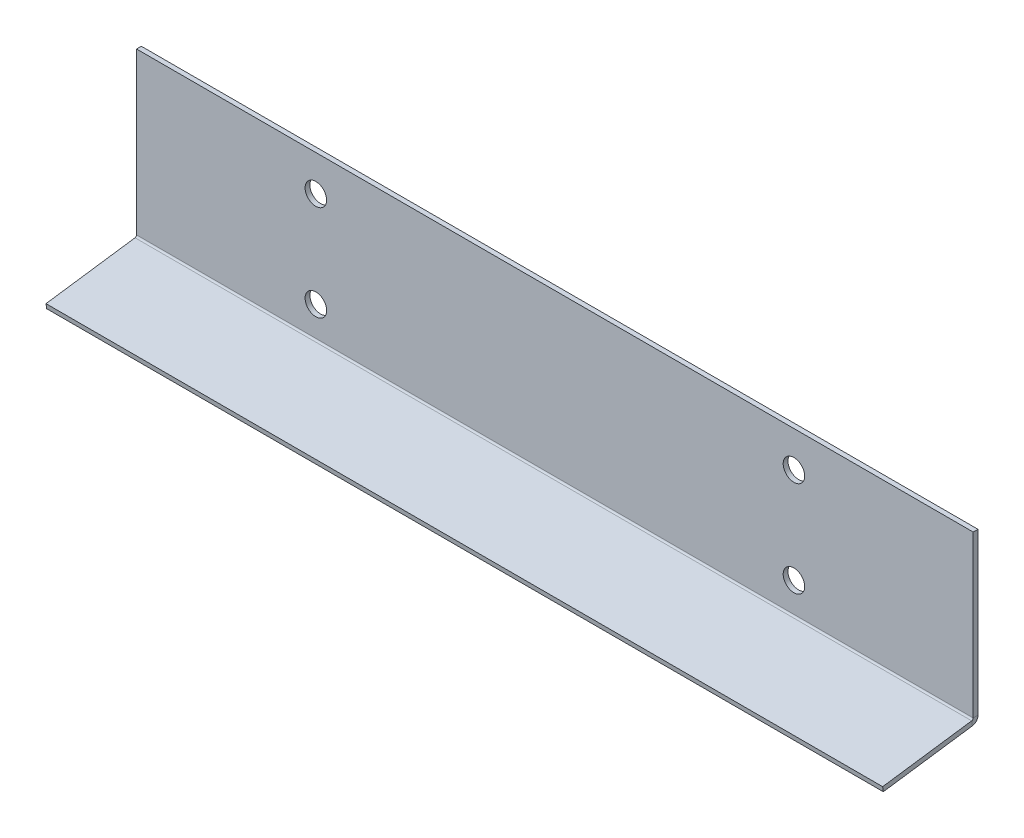
ISO-10303-21;
HEADER;
FILE_DESCRIPTION(('STEP AP214'),'2;1');
FILE_NAME('part.step','',(''),(''),'','','');
FILE_SCHEMA(('AUTOMOTIVE_DESIGN { 1 0 10303 214 1 1 1 1 }'));
ENDSEC;
DATA;
#1=APPLICATION_CONTEXT('core data for automotive mechanical design processes');
#2=APPLICATION_PROTOCOL_DEFINITION('international standard','automotive_design',2000,#1);
#3=PRODUCT_CONTEXT('',#1,'mechanical');
#4=PRODUCT('Part','Part','',(#3));
#5=PRODUCT_RELATED_PRODUCT_CATEGORY('part','',(#4));
#6=PRODUCT_DEFINITION_FORMATION('','',#4);
#7=PRODUCT_DEFINITION_CONTEXT('part definition',#1,'design');
#8=PRODUCT_DEFINITION('design','',#6,#7);
#9=PRODUCT_DEFINITION_SHAPE('','',#8);
#10=(LENGTH_UNIT() NAMED_UNIT(*) SI_UNIT(.MILLI.,.METRE.));
#11=(NAMED_UNIT(*) PLANE_ANGLE_UNIT() SI_UNIT($,.RADIAN.));
#12=(NAMED_UNIT(*) SI_UNIT($,.STERADIAN.) SOLID_ANGLE_UNIT());
#13=UNCERTAINTY_MEASURE_WITH_UNIT(LENGTH_MEASURE(1.E-05),#10,'distance_accuracy_value','');
#14=(GEOMETRIC_REPRESENTATION_CONTEXT(3) GLOBAL_UNCERTAINTY_ASSIGNED_CONTEXT((#13)) GLOBAL_UNIT_ASSIGNED_CONTEXT((#10,
#11,#12)) REPRESENTATION_CONTEXT('',''));
#15=CARTESIAN_POINT('',(0.,0.,0.));
#16=DIRECTION('',(0.,0.,1.));
#17=DIRECTION('',(1.,0.,0.));
#18=AXIS2_PLACEMENT_3D('',#15,#16,#17);
#19=CARTESIAN_POINT('',(175.,-35.,-2.));
#20=DIRECTION('',(1.,0.,0.));
#21=DIRECTION('',(0.,0.,-1.));
#22=AXIS2_PLACEMENT_3D('',#19,#20,#21);
#23=PLANE('',#22);
#24=DIRECTION('',(0.,1.,0.));
#25=VECTOR('',#24,1.);
#26=CARTESIAN_POINT('',(175.,-35.,0.));
#27=LINE('',#26,#25);
#28=CARTESIAN_POINT('',(175.,-32.3400282438873,0.));
#29=VERTEX_POINT('',#28);
#30=CARTESIAN_POINT('',(175.,35.,0.));
#31=VERTEX_POINT('',#30);
#32=EDGE_CURVE('E105',#29,#31,#27,.T.);
#33=ORIENTED_EDGE('',*,*,#32,.F.);
#34=DIRECTION('',(0.,0.,-1.));
#35=VECTOR('',#34,1.);
#36=CARTESIAN_POINT('',(175.,-32.3400282438873,0.));
#37=LINE('',#36,#35);
#38=CARTESIAN_POINT('',(175.,-32.3400282438873,-2.00000000000001));
#39=VERTEX_POINT('',#38);
#40=EDGE_CURVE('E117',#29,#39,#37,.T.);
#41=ORIENTED_EDGE('',*,*,#40,.T.);
#42=DIRECTION('',(0.,1.,0.));
#43=VECTOR('',#42,1.);
#44=CARTESIAN_POINT('',(175.,-35.,-2.));
#45=LINE('',#44,#43);
#46=CARTESIAN_POINT('',(175.,35.,-2.));
#47=VERTEX_POINT('',#46);
#48=EDGE_CURVE('E111',#39,#47,#45,.T.);
#49=ORIENTED_EDGE('',*,*,#48,.T.);
#50=DIRECTION('',(0.,0.,1.));
#51=VECTOR('',#50,1.);
#52=CARTESIAN_POINT('',(175.,35.,-2.));
#53=LINE('',#52,#51);
#54=EDGE_CURVE('E64',#47,#31,#53,.T.);
#55=ORIENTED_EDGE('',*,*,#54,.T.);
#56=EDGE_LOOP('',(#33,#41,#49,#55));
#57=FACE_BOUND('',#56,.T.);
#58=ADVANCED_FACE('F60',(#57),#23,.T.);
#59=CARTESIAN_POINT('',(0.,0.,-2.));
#60=DIRECTION('',(0.,0.,1.));
#61=DIRECTION('',(1.,0.,0.));
#62=AXIS2_PLACEMENT_3D('',#59,#60,#61);
#63=PLANE('',#62);
#64=CARTESIAN_POINT('',(-100.,20.,-2.00000000000002));
#65=DIRECTION('',(0.,0.,1.));
#66=DIRECTION('',(1.,0.,0.));
#67=AXIS2_PLACEMENT_3D('',#64,#65,#66);
#68=CIRCLE('',#67,4.5);
#69=CARTESIAN_POINT('',(-95.5,20.,-2.00000000000002));
#70=VERTEX_POINT('',#69);
#71=EDGE_CURVE('E191',#70,#70,#68,.T.);
#72=ORIENTED_EDGE('',*,*,#71,.T.);
#73=EDGE_LOOP('',(#72));
#74=FACE_BOUND('',#73,.T.);
#75=CARTESIAN_POINT('',(-100.,-20.,-2.00000000000002));
#76=DIRECTION('',(0.,0.,1.));
#77=DIRECTION('',(1.,0.,0.));
#78=AXIS2_PLACEMENT_3D('',#75,#76,#77);
#79=CIRCLE('',#78,4.5);
#80=CARTESIAN_POINT('',(-95.5,-20.,-2.00000000000002));
#81=VERTEX_POINT('',#80);
#82=EDGE_CURVE('E185',#81,#81,#79,.T.);
#83=ORIENTED_EDGE('',*,*,#82,.T.);
#84=EDGE_LOOP('',(#83));
#85=FACE_BOUND('',#84,.T.);
#86=CARTESIAN_POINT('',(100.,-20.,-2.00000000000002));
#87=DIRECTION('',(0.,0.,1.));
#88=DIRECTION('',(1.,0.,0.));
#89=AXIS2_PLACEMENT_3D('',#86,#87,#88);
#90=CIRCLE('',#89,4.5);
#91=CARTESIAN_POINT('',(104.5,-20.,-2.00000000000002));
#92=VERTEX_POINT('',#91);
#93=EDGE_CURVE('E179',#92,#92,#90,.T.);
#94=ORIENTED_EDGE('',*,*,#93,.T.);
#95=EDGE_LOOP('',(#94));
#96=FACE_BOUND('',#95,.T.);
#97=CARTESIAN_POINT('',(100.,20.,-2.00000000000002));
#98=DIRECTION('',(0.,0.,1.));
#99=DIRECTION('',(1.,0.,0.));
#100=AXIS2_PLACEMENT_3D('',#97,#98,#99);
#101=CIRCLE('',#100,4.5);
#102=CARTESIAN_POINT('',(104.5,20.,-2.00000000000002));
#103=VERTEX_POINT('',#102);
#104=EDGE_CURVE('E142',#103,#103,#101,.T.);
#105=ORIENTED_EDGE('',*,*,#104,.T.);
#106=EDGE_LOOP('',(#105));
#107=FACE_BOUND('',#106,.T.);
#108=DIRECTION('',(1.,0.,0.));
#109=VECTOR('',#108,1.);
#110=CARTESIAN_POINT('',(175.,-32.3400282438873,-2.00000000000001));
#111=LINE('',#110,#109);
#112=CARTESIAN_POINT('',(-175.,-32.3400282438873,-2.));
#113=VERTEX_POINT('',#112);
#114=EDGE_CURVE('E133',#39,#113,#111,.F.);
#115=ORIENTED_EDGE('',*,*,#114,.T.);
#116=DIRECTION('',(0.,-1.,0.));
#117=VECTOR('',#116,1.);
#118=CARTESIAN_POINT('',(-175.,-35.,-2.));
#119=LINE('',#118,#117);
#120=CARTESIAN_POINT('',(-175.,35.,-2.));
#121=VERTEX_POINT('',#120);
#122=EDGE_CURVE('E109',#121,#113,#119,.T.);
#123=ORIENTED_EDGE('',*,*,#122,.F.);
#124=DIRECTION('',(-1.,0.,0.));
#125=VECTOR('',#124,1.);
#126=CARTESIAN_POINT('',(175.,35.,-2.));
#127=LINE('',#126,#125);
#128=EDGE_CURVE('E99',#47,#121,#127,.T.);
#129=ORIENTED_EDGE('',*,*,#128,.F.);
#130=ORIENTED_EDGE('',*,*,#48,.F.);
#131=EDGE_LOOP('',(#115,#123,#129,#130));
#132=FACE_BOUND('',#131,.T.);
#133=ADVANCED_FACE('F202',(#74,#85,#96,#107,#132),#63,.F.);
#134=CARTESIAN_POINT('',(0.,0.,0.));
#135=DIRECTION('',(0.,0.,1.));
#136=DIRECTION('',(1.,0.,0.));
#137=AXIS2_PLACEMENT_3D('',#134,#135,#136);
#138=PLANE('',#137);
#139=CARTESIAN_POINT('',(-100.,20.,0.));
#140=DIRECTION('',(0.,0.,1.));
#141=DIRECTION('',(1.,0.,0.));
#142=AXIS2_PLACEMENT_3D('',#139,#140,#141);
#143=CIRCLE('',#142,4.5);
#144=CARTESIAN_POINT('',(-95.5,20.,0.));
#145=VERTEX_POINT('',#144);
#146=EDGE_CURVE('E194',#145,#145,#143,.T.);
#147=ORIENTED_EDGE('',*,*,#146,.F.);
#148=EDGE_LOOP('',(#147));
#149=FACE_BOUND('',#148,.T.);
#150=CARTESIAN_POINT('',(-100.,-20.,0.));
#151=DIRECTION('',(0.,0.,1.));
#152=DIRECTION('',(1.,0.,0.));
#153=AXIS2_PLACEMENT_3D('',#150,#151,#152);
#154=CIRCLE('',#153,4.5);
#155=CARTESIAN_POINT('',(-95.5,-20.,0.));
#156=VERTEX_POINT('',#155);
#157=EDGE_CURVE('E188',#156,#156,#154,.T.);
#158=ORIENTED_EDGE('',*,*,#157,.F.);
#159=EDGE_LOOP('',(#158));
#160=FACE_BOUND('',#159,.T.);
#161=CARTESIAN_POINT('',(100.,-20.,0.));
#162=DIRECTION('',(0.,0.,1.));
#163=DIRECTION('',(1.,0.,0.));
#164=AXIS2_PLACEMENT_3D('',#161,#162,#163);
#165=CIRCLE('',#164,4.5);
#166=CARTESIAN_POINT('',(104.5,-20.,0.));
#167=VERTEX_POINT('',#166);
#168=EDGE_CURVE('E182',#167,#167,#165,.T.);
#169=ORIENTED_EDGE('',*,*,#168,.F.);
#170=EDGE_LOOP('',(#169));
#171=FACE_BOUND('',#170,.T.);
#172=CARTESIAN_POINT('',(100.,20.,0.));
#173=DIRECTION('',(0.,0.,1.));
#174=DIRECTION('',(1.,0.,0.));
#175=AXIS2_PLACEMENT_3D('',#172,#173,#174);
#176=CIRCLE('',#175,4.5);
#177=CARTESIAN_POINT('',(104.5,20.,0.));
#178=VERTEX_POINT('',#177);
#179=EDGE_CURVE('E176',#178,#178,#176,.T.);
#180=ORIENTED_EDGE('',*,*,#179,.F.);
#181=EDGE_LOOP('',(#180));
#182=FACE_BOUND('',#181,.T.);
#183=DIRECTION('',(0.,-1.,0.));
#184=VECTOR('',#183,1.);
#185=CARTESIAN_POINT('',(-175.,-35.,0.));
#186=LINE('',#185,#184);
#187=CARTESIAN_POINT('',(-175.,35.,0.));
#188=VERTEX_POINT('',#187);
#189=CARTESIAN_POINT('',(-175.,-32.3400282438873,0.));
#190=VERTEX_POINT('',#189);
#191=EDGE_CURVE('E101',#188,#190,#186,.T.);
#192=ORIENTED_EDGE('',*,*,#191,.T.);
#193=DIRECTION('',(1.,0.,0.));
#194=VECTOR('',#193,1.);
#195=CARTESIAN_POINT('',(175.,-32.3400282438873,0.));
#196=LINE('',#195,#194);
#197=EDGE_CURVE('E75',#29,#190,#196,.F.);
#198=ORIENTED_EDGE('',*,*,#197,.F.);
#199=ORIENTED_EDGE('',*,*,#32,.T.);
#200=DIRECTION('',(-1.,0.,0.));
#201=VECTOR('',#200,1.);
#202=CARTESIAN_POINT('',(175.,35.,0.));
#203=LINE('',#202,#201);
#204=EDGE_CURVE('E97',#31,#188,#203,.T.);
#205=ORIENTED_EDGE('',*,*,#204,.T.);
#206=EDGE_LOOP('',(#192,#198,#199,#205));
#207=FACE_BOUND('',#206,.T.);
#208=ADVANCED_FACE('F107',(#149,#160,#171,#182,#207),#138,.T.);
#209=CARTESIAN_POINT('',(-175.,-35.,-2.));
#210=DIRECTION('',(-1.,0.,0.));
#211=DIRECTION('',(0.,0.,1.));
#212=AXIS2_PLACEMENT_3D('',#209,#210,#211);
#213=PLANE('',#212);
#214=DIRECTION('',(0.,0.,-1.));
#215=VECTOR('',#214,1.);
#216=CARTESIAN_POINT('',(-175.,-32.3400282438873,0.));
#217=LINE('',#216,#215);
#218=EDGE_CURVE('E104',#190,#113,#217,.T.);
#219=ORIENTED_EDGE('',*,*,#218,.F.);
#220=ORIENTED_EDGE('',*,*,#191,.F.);
#221=DIRECTION('',(0.,0.,1.));
#222=VECTOR('',#221,1.);
#223=CARTESIAN_POINT('',(-175.,35.,-2.));
#224=LINE('',#223,#222);
#225=EDGE_CURVE('E13',#121,#188,#224,.T.);
#226=ORIENTED_EDGE('',*,*,#225,.F.);
#227=ORIENTED_EDGE('',*,*,#122,.T.);
#228=EDGE_LOOP('',(#219,#220,#226,#227));
#229=FACE_BOUND('',#228,.T.);
#230=ADVANCED_FACE('F62',(#229),#213,.T.);
#231=CARTESIAN_POINT('',(175.,35.,-2.));
#232=DIRECTION('',(0.,1.,0.));
#233=DIRECTION('',(-1.,0.,0.));
#234=AXIS2_PLACEMENT_3D('',#231,#232,#233);
#235=PLANE('',#234);
#236=ORIENTED_EDGE('',*,*,#204,.F.);
#237=ORIENTED_EDGE('',*,*,#54,.F.);
#238=ORIENTED_EDGE('',*,*,#128,.T.);
#239=ORIENTED_EDGE('',*,*,#225,.T.);
#240=EDGE_LOOP('',(#236,#237,#238,#239));
#241=FACE_BOUND('',#240,.T.);
#242=ADVANCED_FACE('F94',(#241),#235,.T.);
#243=CARTESIAN_POINT('',(-175.,-32.3400282438874,0.736599999999989));
#244=DIRECTION('',(-1.,0.,0.));
#245=DIRECTION('',(0.,0.,1.));
#246=AXIS2_PLACEMENT_3D('',#243,#244,#245);
#247=PLANE('',#246);
#248=DIRECTION('',(0.,0.99026806874157,0.139173100960069));
#249=VECTOR('',#248,1.);
#250=CARTESIAN_POINT('',(-175.,-35.0499958408056,0.355738891912671));
#251=LINE('',#250,#249);
#252=CARTESIAN_POINT('',(-175.,-33.0694597033224,0.634085093832799));
#253=VERTEX_POINT('',#252);
#254=CARTESIAN_POINT('',(-175.,-35.0499958408056,0.355738891912661));
#255=VERTEX_POINT('',#254);
#256=EDGE_CURVE('E138',#253,#255,#251,.F.);
#257=ORIENTED_EDGE('',*,*,#256,.F.);
#258=CARTESIAN_POINT('',(-175.,-32.3400282438874,0.736599999999989));
#259=DIRECTION('',(1.,0.,0.));
#260=DIRECTION('',(0.,0.,-1.));
#261=AXIS2_PLACEMENT_3D('',#258,#259,#260);
#262=CIRCLE('',#261,0.736600000000021);
#263=EDGE_CURVE('E127',#190,#253,#262,.F.);
#264=ORIENTED_EDGE('',*,*,#263,.F.);
#265=ORIENTED_EDGE('',*,*,#218,.T.);
#266=CARTESIAN_POINT('',(-175.,-32.3400282438874,0.736599999999989));
#267=DIRECTION('',(1.,0.,0.));
#268=DIRECTION('',(0.,0.,-1.));
#269=AXIS2_PLACEMENT_3D('',#266,#267,#268);
#270=CIRCLE('',#269,2.73660000000002);
#271=EDGE_CURVE('E120',#113,#255,#270,.F.);
#272=ORIENTED_EDGE('',*,*,#271,.T.);
#273=EDGE_LOOP('',(#257,#264,#265,#272));
#274=FACE_BOUND('',#273,.T.);
#275=ADVANCED_FACE('F237',(#274),#247,.T.);
#276=CARTESIAN_POINT('',(175.,-32.3400282438874,0.736600000000015));
#277=DIRECTION('',(-1.,0.,0.));
#278=DIRECTION('',(0.,0.,1.));
#279=AXIS2_PLACEMENT_3D('',#276,#277,#278);
#280=PLANE('',#279);
#281=CARTESIAN_POINT('',(175.,-32.3400282438874,0.736600000000015));
#282=DIRECTION('',(1.,0.,0.));
#283=DIRECTION('',(0.,0.,-1.));
#284=AXIS2_PLACEMENT_3D('',#281,#282,#283);
#285=CIRCLE('',#284,0.736600000000021);
#286=CARTESIAN_POINT('',(175.,-33.0694597033224,0.634085093832825));
#287=VERTEX_POINT('',#286);
#288=EDGE_CURVE('E122',#287,#29,#285,.T.);
#289=ORIENTED_EDGE('',*,*,#288,.F.);
#290=DIRECTION('',(0.,0.99026806874157,0.139173100960069));
#291=VECTOR('',#290,1.);
#292=CARTESIAN_POINT('',(175.,-33.0694597033224,0.634085093832823));
#293=LINE('',#292,#291);
#294=CARTESIAN_POINT('',(175.,-35.0499958408055,0.355738891912683));
#295=VERTEX_POINT('',#294);
#296=EDGE_CURVE('E145',#287,#295,#293,.F.);
#297=ORIENTED_EDGE('',*,*,#296,.T.);
#298=CARTESIAN_POINT('',(175.,-32.3400282438874,0.736600000000015));
#299=DIRECTION('',(1.,0.,0.));
#300=DIRECTION('',(0.,0.,-1.));
#301=AXIS2_PLACEMENT_3D('',#298,#299,#300);
#302=CIRCLE('',#301,2.73660000000002);
#303=EDGE_CURVE('E130',#295,#39,#302,.T.);
#304=ORIENTED_EDGE('',*,*,#303,.T.);
#305=ORIENTED_EDGE('',*,*,#40,.F.);
#306=EDGE_LOOP('',(#289,#297,#304,#305));
#307=FACE_BOUND('',#306,.T.);
#308=ADVANCED_FACE('F239',(#307),#280,.F.);
#309=CARTESIAN_POINT('',(175.,-32.3400282438874,0.736600000000015));
#310=DIRECTION('',(1.,0.,0.));
#311=DIRECTION('',(0.,-0.99026806874157,-0.139173100960069));
#312=AXIS2_PLACEMENT_3D('',#309,#310,#311);
#313=CYLINDRICAL_SURFACE('',#312,2.73660000000002);
#314=ORIENTED_EDGE('',*,*,#114,.F.);
#315=ORIENTED_EDGE('',*,*,#303,.F.);
#316=DIRECTION('',(1.,0.,0.));
#317=VECTOR('',#316,1.);
#318=CARTESIAN_POINT('',(-175.,-35.0499958408056,0.355738891912669));
#319=LINE('',#318,#317);
#320=EDGE_CURVE('E148',#295,#255,#319,.F.);
#321=ORIENTED_EDGE('',*,*,#320,.T.);
#322=ORIENTED_EDGE('',*,*,#271,.F.);
#323=EDGE_LOOP('',(#314,#315,#321,#322));
#324=FACE_BOUND('',#323,.T.);
#325=ADVANCED_FACE('F242',(#324),#313,.T.);
#326=CARTESIAN_POINT('',(175.,-32.3400282438874,0.736600000000015));
#327=DIRECTION('',(1.,0.,0.));
#328=DIRECTION('',(0.,-0.99026806874157,-0.139173100960069));
#329=AXIS2_PLACEMENT_3D('',#326,#327,#328);
#330=CYLINDRICAL_SURFACE('',#329,0.736600000000021);
#331=ORIENTED_EDGE('',*,*,#197,.T.);
#332=ORIENTED_EDGE('',*,*,#263,.T.);
#333=DIRECTION('',(1.,0.,0.));
#334=VECTOR('',#333,1.);
#335=CARTESIAN_POINT('',(-175.,-33.0694597033224,0.634085093832809));
#336=LINE('',#335,#334);
#337=EDGE_CURVE('E141',#253,#287,#336,.T.);
#338=ORIENTED_EDGE('',*,*,#337,.T.);
#339=ORIENTED_EDGE('',*,*,#288,.T.);
#340=EDGE_LOOP('',(#331,#332,#338,#339));
#341=FACE_BOUND('',#340,.T.);
#342=ADVANCED_FACE('F247',(#341),#330,.F.);
#343=CARTESIAN_POINT('',(-175.,-34.9608809924459,-0.278346201920139));
#344=DIRECTION('',(1.,0.,0.));
#345=DIRECTION('',(0.,1.,0.));
#346=AXIS2_PLACEMENT_3D('',#343,#344,#345);
#347=PLANE('',#346);
#348=ORIENTED_EDGE('',*,*,#256,.T.);
#349=DIRECTION('',(0.,0.139173100960069,-0.99026806874157));
#350=VECTOR('',#349,1.);
#351=CARTESIAN_POINT('',(-175.,-34.2829606713665,-5.10199992871776));
#352=LINE('',#351,#350);
#353=CARTESIAN_POINT('',(-175.,-40.285842368998,37.6107227496628));
#354=VERTEX_POINT('',#353);
#355=EDGE_CURVE('E160',#354,#255,#352,.T.);
#356=ORIENTED_EDGE('',*,*,#355,.F.);
#357=DIRECTION('',(0.,0.99026806874157,0.139173100960069));
#358=VECTOR('',#357,1.);
#359=CARTESIAN_POINT('',(-175.,-40.285842368998,37.6107227496628));
#360=LINE('',#359,#358);
#361=CARTESIAN_POINT('',(-175.,-38.3053062315149,37.8890689515829));
#362=VERTEX_POINT('',#361);
#363=EDGE_CURVE('E169',#354,#362,#360,.T.);
#364=ORIENTED_EDGE('',*,*,#363,.T.);
#365=DIRECTION('',(0.,-0.139173100960069,0.99026806874157));
#366=VECTOR('',#365,1.);
#367=CARTESIAN_POINT('',(-175.,-32.9803448549628,0.));
#368=LINE('',#367,#366);
#369=EDGE_CURVE('E151',#362,#253,#368,.F.);
#370=ORIENTED_EDGE('',*,*,#369,.T.);
#371=EDGE_LOOP('',(#348,#356,#364,#370));
#372=FACE_BOUND('',#371,.T.);
#373=ADVANCED_FACE('F250',(#372),#347,.F.);
#374=CARTESIAN_POINT('',(175.,-40.285842368998,37.6107227496628));
#375=DIRECTION('',(-1.,0.,0.));
#376=DIRECTION('',(0.,-1.,0.));
#377=AXIS2_PLACEMENT_3D('',#374,#375,#376);
#378=PLANE('',#377);
#379=ORIENTED_EDGE('',*,*,#296,.F.);
#380=DIRECTION('',(0.,0.139173100960069,-0.99026806874157));
#381=VECTOR('',#380,1.);
#382=CARTESIAN_POINT('',(175.,-38.3053062315149,37.8890689515829));
#383=LINE('',#382,#381);
#384=CARTESIAN_POINT('',(175.,-38.3053062315149,37.8890689515829));
#385=VERTEX_POINT('',#384);
#386=EDGE_CURVE('E154',#287,#385,#383,.F.);
#387=ORIENTED_EDGE('',*,*,#386,.T.);
#388=DIRECTION('',(0.,0.99026806874157,0.139173100960069));
#389=VECTOR('',#388,1.);
#390=CARTESIAN_POINT('',(175.,-40.285842368998,37.6107227496628));
#391=LINE('',#390,#389);
#392=CARTESIAN_POINT('',(175.,-40.285842368998,37.6107227496628));
#393=VERTEX_POINT('',#392);
#394=EDGE_CURVE('E125',#393,#385,#391,.T.);
#395=ORIENTED_EDGE('',*,*,#394,.F.);
#396=DIRECTION('',(0.,-0.139173100960069,0.99026806874157));
#397=VECTOR('',#396,1.);
#398=CARTESIAN_POINT('',(175.,-34.2829606713665,-5.10199992871775));
#399=LINE('',#398,#397);
#400=EDGE_CURVE('E163',#295,#393,#399,.T.);
#401=ORIENTED_EDGE('',*,*,#400,.F.);
#402=EDGE_LOOP('',(#379,#387,#395,#401));
#403=FACE_BOUND('',#402,.T.);
#404=ADVANCED_FACE('F257',(#403),#378,.F.);
#405=CARTESIAN_POINT('',(0.,-34.2829606713665,-5.10199992871776));
#406=DIRECTION('',(0.,0.99026806874157,0.139173100960069));
#407=DIRECTION('',(0.,-0.139173100960069,0.99026806874157));
#408=AXIS2_PLACEMENT_3D('',#405,#406,#407);
#409=PLANE('',#408);
#410=ORIENTED_EDGE('',*,*,#320,.F.);
#411=ORIENTED_EDGE('',*,*,#400,.T.);
#412=DIRECTION('',(-1.,0.,0.));
#413=VECTOR('',#412,1.);
#414=CARTESIAN_POINT('',(0.,-40.285842368998,37.6107227496628));
#415=LINE('',#414,#413);
#416=EDGE_CURVE('E166',#393,#354,#415,.T.);
#417=ORIENTED_EDGE('',*,*,#416,.T.);
#418=ORIENTED_EDGE('',*,*,#355,.T.);
#419=EDGE_LOOP('',(#410,#411,#417,#418));
#420=FACE_BOUND('',#419,.T.);
#421=ADVANCED_FACE('F260',(#420),#409,.F.);
#422=CARTESIAN_POINT('',(0.,-32.3024245338833,-4.82365372679762));
#423=DIRECTION('',(0.,0.99026806874157,0.139173100960069));
#424=DIRECTION('',(0.,-0.139173100960069,0.99026806874157));
#425=AXIS2_PLACEMENT_3D('',#422,#423,#424);
#426=PLANE('',#425);
#427=ORIENTED_EDGE('',*,*,#386,.F.);
#428=ORIENTED_EDGE('',*,*,#337,.F.);
#429=ORIENTED_EDGE('',*,*,#369,.F.);
#430=DIRECTION('',(1.,0.,0.));
#431=VECTOR('',#430,1.);
#432=CARTESIAN_POINT('',(-175.,-38.3053062315149,37.8890689515829));
#433=LINE('',#432,#431);
#434=EDGE_CURVE('E157',#385,#362,#433,.F.);
#435=ORIENTED_EDGE('',*,*,#434,.F.);
#436=EDGE_LOOP('',(#427,#428,#429,#435));
#437=FACE_BOUND('',#436,.T.);
#438=ADVANCED_FACE('F223',(#437),#426,.T.);
#439=CARTESIAN_POINT('',(-175.,-40.285842368998,37.6107227496628));
#440=DIRECTION('',(0.,0.139173100960069,-0.99026806874157));
#441=DIRECTION('',(0.,0.99026806874157,0.139173100960069));
#442=AXIS2_PLACEMENT_3D('',#439,#440,#441);
#443=PLANE('',#442);
#444=ORIENTED_EDGE('',*,*,#434,.T.);
#445=ORIENTED_EDGE('',*,*,#363,.F.);
#446=ORIENTED_EDGE('',*,*,#416,.F.);
#447=ORIENTED_EDGE('',*,*,#394,.T.);
#448=EDGE_LOOP('',(#444,#445,#446,#447));
#449=FACE_BOUND('',#448,.T.);
#450=ADVANCED_FACE('F213',(#449),#443,.F.);
#451=CARTESIAN_POINT('',(100.,20.,0.));
#452=DIRECTION('',(0.,0.,1.));
#453=DIRECTION('',(1.,0.,0.));
#454=AXIS2_PLACEMENT_3D('',#451,#452,#453);
#455=CYLINDRICAL_SURFACE('',#454,4.5);
#456=ORIENTED_EDGE('',*,*,#104,.F.);
#457=EDGE_LOOP('',(#456));
#458=FACE_BOUND('',#457,.T.);
#459=ORIENTED_EDGE('',*,*,#179,.T.);
#460=EDGE_LOOP('',(#459));
#461=FACE_BOUND('',#460,.T.);
#462=ADVANCED_FACE('F210',(#458,#461),#455,.F.);
#463=CARTESIAN_POINT('',(100.,-20.,0.));
#464=DIRECTION('',(0.,0.,1.));
#465=DIRECTION('',(1.,0.,0.));
#466=AXIS2_PLACEMENT_3D('',#463,#464,#465);
#467=CYLINDRICAL_SURFACE('',#466,4.5);
#468=ORIENTED_EDGE('',*,*,#93,.F.);
#469=EDGE_LOOP('',(#468));
#470=FACE_BOUND('',#469,.T.);
#471=ORIENTED_EDGE('',*,*,#168,.T.);
#472=EDGE_LOOP('',(#471));
#473=FACE_BOUND('',#472,.T.);
#474=ADVANCED_FACE('F212',(#470,#473),#467,.F.);
#475=CARTESIAN_POINT('',(-100.,-20.,0.));
#476=DIRECTION('',(0.,0.,1.));
#477=DIRECTION('',(1.,0.,0.));
#478=AXIS2_PLACEMENT_3D('',#475,#476,#477);
#479=CYLINDRICAL_SURFACE('',#478,4.5);
#480=ORIENTED_EDGE('',*,*,#82,.F.);
#481=EDGE_LOOP('',(#480));
#482=FACE_BOUND('',#481,.T.);
#483=ORIENTED_EDGE('',*,*,#157,.T.);
#484=EDGE_LOOP('',(#483));
#485=FACE_BOUND('',#484,.T.);
#486=ADVANCED_FACE('F220',(#482,#485),#479,.F.);
#487=CARTESIAN_POINT('',(-100.,20.,0.));
#488=DIRECTION('',(0.,0.,1.));
#489=DIRECTION('',(1.,0.,0.));
#490=AXIS2_PLACEMENT_3D('',#487,#488,#489);
#491=CYLINDRICAL_SURFACE('',#490,4.5);
#492=ORIENTED_EDGE('',*,*,#71,.F.);
#493=EDGE_LOOP('',(#492));
#494=FACE_BOUND('',#493,.T.);
#495=ORIENTED_EDGE('',*,*,#146,.T.);
#496=EDGE_LOOP('',(#495));
#497=FACE_BOUND('',#496,.T.);
#498=ADVANCED_FACE('F198',(#494,#497),#491,.F.);
#499=CLOSED_SHELL('',(#58,#133,#208,#230,#242,#275,#308,#325,#342,#373,#404,#421,#438,#450,#462,
#474,#486,#498));
#500=MANIFOLD_SOLID_BREP('B2',#499);
#501=ADVANCED_BREP_SHAPE_REPRESENTATION('',(#18,#500),#14);
#502=SHAPE_DEFINITION_REPRESENTATION(#9,#501);
ENDSEC;
END-ISO-10303-21;
